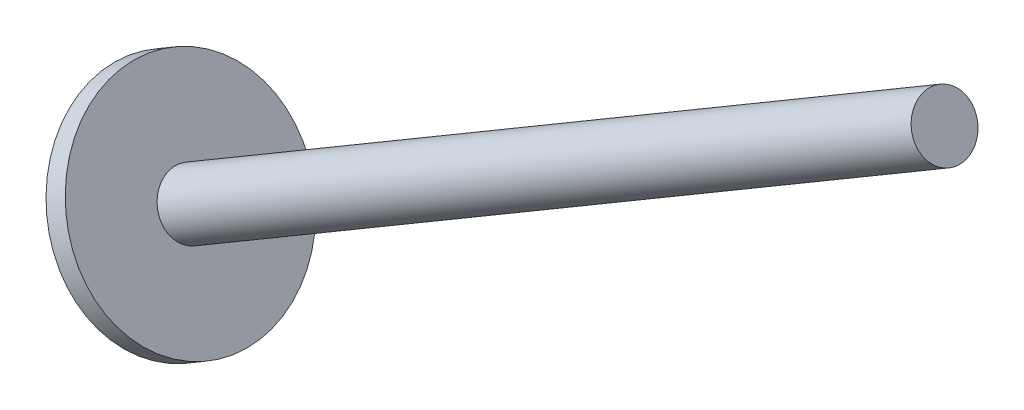
ISO-10303-21;
HEADER;
FILE_DESCRIPTION(('STEP AP214'),'2;1');
FILE_NAME('part.step','',(''),(''),'','','');
FILE_SCHEMA(('AUTOMOTIVE_DESIGN { 1 0 10303 214 1 1 1 1 }'));
ENDSEC;
DATA;
#1=APPLICATION_CONTEXT('core data for automotive mechanical design processes');
#2=APPLICATION_PROTOCOL_DEFINITION('international standard','automotive_design',2000,#1);
#3=PRODUCT_CONTEXT('',#1,'mechanical');
#4=PRODUCT('Part','Part','',(#3));
#5=PRODUCT_RELATED_PRODUCT_CATEGORY('part','',(#4));
#6=PRODUCT_DEFINITION_FORMATION('','',#4);
#7=PRODUCT_DEFINITION_CONTEXT('part definition',#1,'design');
#8=PRODUCT_DEFINITION('design','',#6,#7);
#9=PRODUCT_DEFINITION_SHAPE('','',#8);
#10=(LENGTH_UNIT() NAMED_UNIT(*) SI_UNIT(.MILLI.,.METRE.));
#11=(NAMED_UNIT(*) PLANE_ANGLE_UNIT() SI_UNIT($,.RADIAN.));
#12=(NAMED_UNIT(*) SI_UNIT($,.STERADIAN.) SOLID_ANGLE_UNIT());
#13=UNCERTAINTY_MEASURE_WITH_UNIT(LENGTH_MEASURE(1.E-05),#10,'distance_accuracy_value','');
#14=(GEOMETRIC_REPRESENTATION_CONTEXT(3) GLOBAL_UNCERTAINTY_ASSIGNED_CONTEXT((#13)) GLOBAL_UNIT_ASSIGNED_CONTEXT((#10,
#11,#12)) REPRESENTATION_CONTEXT('',''));
#15=CARTESIAN_POINT('',(0.,0.,0.));
#16=DIRECTION('',(0.,0.,1.));
#17=DIRECTION('',(1.,0.,0.));
#18=AXIS2_PLACEMENT_3D('',#15,#16,#17);
#19=CARTESIAN_POINT('',(51.1847327277885,397.594630363069,5.56110713034741E-09));
#20=DIRECTION('',(-0.861436539548358,-0.507865226542386,-6.98709345747228E-12));
#21=DIRECTION('',(-0.475844139078709,0.807122652048079,0.349464418582663));
#22=AXIS2_PLACEMENT_3D('',#19,#20,#21);
#23=CYLINDRICAL_SURFACE('',#22,4.);
#24=CARTESIAN_POINT('',(-41.4196931455379,342.99911976441,4.80931960922248E-09));
#25=DIRECTION('',(0.861436540707187,0.507865224576792,6.12462643507797E-09));
#26=DIRECTION('',(-0.475844139078709,0.807122652048079,0.349464418582663));
#27=AXIS2_PLACEMENT_3D('',#24,#25,#26);
#28=CIRCLE('',#27,4.);
#29=CARTESIAN_POINT('',(-39.516316589223,339.770629156218,-1.39785766952133));
#30=VERTEX_POINT('',#29);
#31=EDGE_CURVE('E85',#30,#30,#28,.T.);
#32=ORIENTED_EDGE('',*,*,#31,.T.);
#33=DIRECTION('',(0.861436539548358,0.507865226542386,6.98709345747228E-12));
#34=VECTOR('',#33,1.);
#35=CARTESIAN_POINT('',(53.0881092841034,394.366139754876,-1.39785766876954));
#36=LINE('',#35,#34);
#37=CARTESIAN_POINT('',(61.7024746795869,399.4447920203,-1.39785766870021));
#38=VERTEX_POINT('',#37);
#39=EDGE_CURVE('E11',#30,#38,#36,.T.);
#40=ORIENTED_EDGE('',*,*,#39,.T.);
#41=CARTESIAN_POINT('',(59.799098123272,402.673282628493,5.63044055823525E-09));
#42=DIRECTION('',(0.861436539548358,0.507865226542386,6.98728071589322E-12));
#43=DIRECTION('',(-0.475844139078709,0.807122652048079,0.349464418582663));
#44=AXIS2_PLACEMENT_3D('',#41,#42,#43);
#45=CIRCLE('',#44,4.);
#46=EDGE_CURVE('E53',#38,#38,#45,.T.);
#47=ORIENTED_EDGE('',*,*,#46,.F.);
#48=ORIENTED_EDGE('',*,*,#39,.F.);
#49=EDGE_LOOP('',(#32,#40,#47,#48));
#50=FACE_BOUND('',#49,.T.);
#51=ADVANCED_FACE('F49',(#50),#23,.T.);
#52=CARTESIAN_POINT('',(59.799098123272,402.673282628493,5.63044055823525E-09));
#53=DIRECTION('',(-0.861436539548358,-0.507865226542386,-6.98728071589322E-12));
#54=DIRECTION('',(-0.177480826106347,0.301041419442451,-0.936949635863466));
#55=AXIS2_PLACEMENT_3D('',#52,#53,#54);
#56=PLANE('',#55);
#57=ORIENTED_EDGE('',*,*,#46,.T.);
#58=EDGE_LOOP('',(#57));
#59=FACE_BOUND('',#58,.T.);
#60=ADVANCED_FACE('F115',(#59),#56,.F.);
#61=CARTESIAN_POINT('',(-44.0040027778521,341.475524107968,-6.73659461547516E-08));
#62=DIRECTION('',(-0.861436540707187,-0.507865224576792,-6.12462525599579E-09));
#63=DIRECTION('',(-0.177480820481758,0.301041422758463,-0.936949635863467));
#64=AXIS2_PLACEMENT_3D('',#61,#62,#63);
#65=PLANE('',#64);
#66=CARTESIAN_POINT('',(-44.0040027778521,341.475524107968,-6.73659461547516E-08));
#67=DIRECTION('',(-0.861436540707187,-0.507865224576792,-6.12462525599579E-09));
#68=DIRECTION('',(-0.475844139078709,0.807122652048079,0.349464418582661));
#69=AXIS2_PLACEMENT_3D('',#66,#67,#68);
#70=CIRCLE('',#69,15.);
#71=CARTESIAN_POINT('',(-36.8663406916715,329.368684327247,-5.24196634610585));
#72=VERTEX_POINT('',#71);
#73=EDGE_CURVE('E91',#72,#72,#70,.T.);
#74=ORIENTED_EDGE('',*,*,#73,.T.);
#75=EDGE_LOOP('',(#74));
#76=FACE_BOUND('',#75,.T.);
#77=ADVANCED_FACE('F51',(#76),#65,.T.);
#78=CARTESIAN_POINT('',(-41.4196931557307,342.999119781699,-4.89925322533225E-08));
#79=DIRECTION('',(-0.861436540707187,-0.507865224576793,-6.12462425437013E-09));
#80=DIRECTION('',(-0.475844139078709,0.807122652048079,0.349464418582661));
#81=AXIS2_PLACEMENT_3D('',#78,#79,#80);
#82=CYLINDRICAL_SURFACE('',#81,15.);
#83=ORIENTED_EDGE('',*,*,#73,.F.);
#84=DIRECTION('',(0.861436540707186,0.507865224576792,6.12462425176805E-09));
#85=VECTOR('',#84,1.);
#86=CARTESIAN_POINT('',(-34.28203106955,330.892280000977,-5.24196632773244));
#87=LINE('',#86,#85);
#88=CARTESIAN_POINT('',(-34.28203106955,330.892280000977,-5.24196632773244));
#89=VERTEX_POINT('',#88);
#90=EDGE_CURVE('E81',#72,#89,#87,.T.);
#91=ORIENTED_EDGE('',*,*,#90,.T.);
#92=CARTESIAN_POINT('',(-41.4196931557307,342.999119781699,-4.89925322533225E-08));
#93=DIRECTION('',(-0.861436540707187,-0.507865224576792,-6.12462525599579E-09));
#94=DIRECTION('',(-0.475844139078709,0.807122652048079,0.349464418582661));
#95=AXIS2_PLACEMENT_3D('',#92,#93,#94);
#96=CIRCLE('',#95,15.);
#97=EDGE_CURVE('E99',#89,#89,#96,.T.);
#98=ORIENTED_EDGE('',*,*,#97,.T.);
#99=ORIENTED_EDGE('',*,*,#90,.F.);
#100=EDGE_LOOP('',(#83,#91,#98,#99));
#101=FACE_BOUND('',#100,.T.);
#102=ADVANCED_FACE('F130',(#101),#82,.T.);
#103=CARTESIAN_POINT('',(-41.4196931557307,342.999119781699,-4.89925322533225E-08));
#104=DIRECTION('',(-0.861436540707187,-0.507865224576792,-6.12462525599579E-09));
#105=DIRECTION('',(-0.177480820481758,0.301041422758463,-0.936949635863467));
#106=AXIS2_PLACEMENT_3D('',#103,#104,#105);
#107=PLANE('',#106);
#108=ORIENTED_EDGE('',*,*,#31,.F.);
#109=EDGE_LOOP('',(#108));
#110=FACE_BOUND('',#109,.T.);
#111=ORIENTED_EDGE('',*,*,#97,.F.);
#112=EDGE_LOOP('',(#111));
#113=FACE_BOUND('',#112,.T.);
#114=ADVANCED_FACE('F125',(#110,#113),#107,.F.);
#115=CLOSED_SHELL('',(#51,#60,#77,#102,#114));
#116=MANIFOLD_SOLID_BREP('B2',#115);
#117=ADVANCED_BREP_SHAPE_REPRESENTATION('',(#18,#116),#14);
#118=SHAPE_DEFINITION_REPRESENTATION(#9,#117);
ENDSEC;
END-ISO-10303-21;
